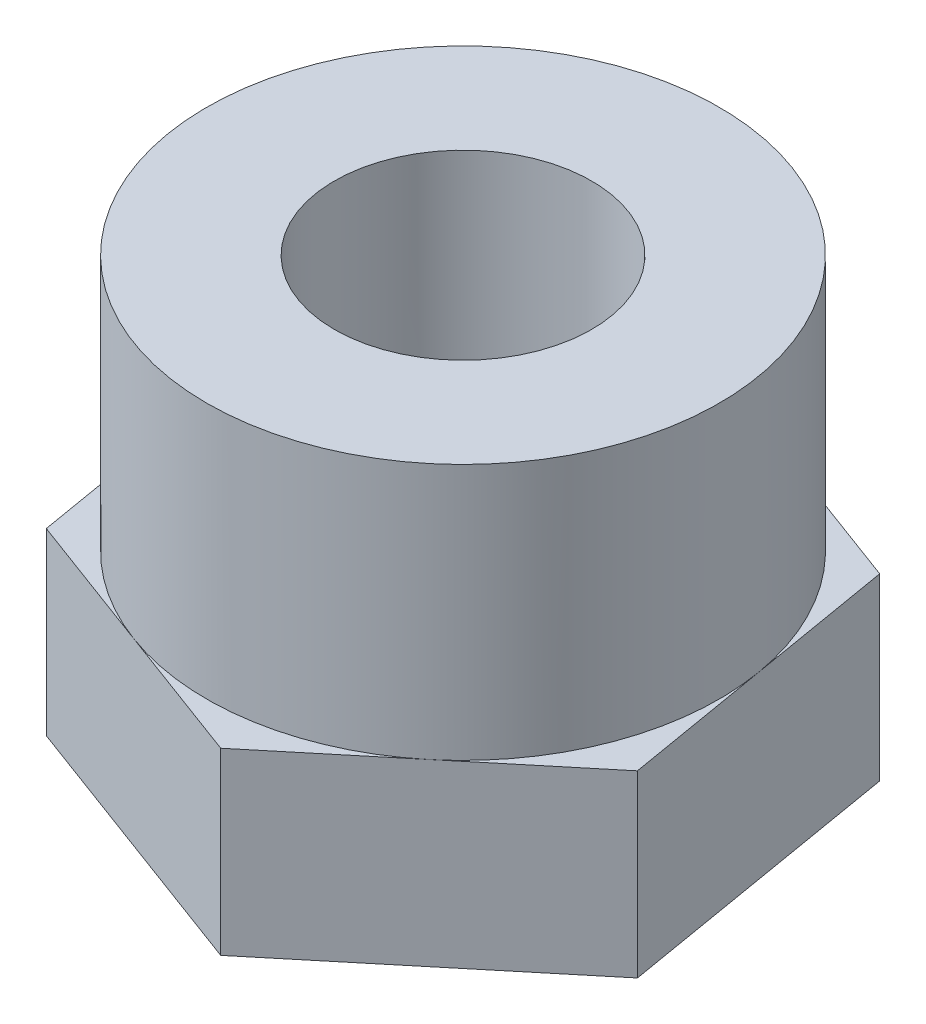
ISO-10303-21;
HEADER;
FILE_DESCRIPTION(('STEP AP214'),'2;1');
FILE_NAME('part.step','',(''),(''),'','','');
FILE_SCHEMA(('AUTOMOTIVE_DESIGN { 1 0 10303 214 1 1 1 1 }'));
ENDSEC;
DATA;
#1=APPLICATION_CONTEXT('core data for automotive mechanical design processes');
#2=APPLICATION_PROTOCOL_DEFINITION('international standard','automotive_design',2000,#1);
#3=PRODUCT_CONTEXT('',#1,'mechanical');
#4=PRODUCT('Part','Part','',(#3));
#5=PRODUCT_RELATED_PRODUCT_CATEGORY('part','',(#4));
#6=PRODUCT_DEFINITION_FORMATION('','',#4);
#7=PRODUCT_DEFINITION_CONTEXT('part definition',#1,'design');
#8=PRODUCT_DEFINITION('design','',#6,#7);
#9=PRODUCT_DEFINITION_SHAPE('','',#8);
#10=(LENGTH_UNIT() NAMED_UNIT(*) SI_UNIT(.MILLI.,.METRE.));
#11=(NAMED_UNIT(*) PLANE_ANGLE_UNIT() SI_UNIT($,.RADIAN.));
#12=(NAMED_UNIT(*) SI_UNIT($,.STERADIAN.) SOLID_ANGLE_UNIT());
#13=UNCERTAINTY_MEASURE_WITH_UNIT(LENGTH_MEASURE(1.E-05),#10,'distance_accuracy_value','');
#14=(GEOMETRIC_REPRESENTATION_CONTEXT(3) GLOBAL_UNCERTAINTY_ASSIGNED_CONTEXT((#13)) GLOBAL_UNIT_ASSIGNED_CONTEXT((#10,
#11,#12)) REPRESENTATION_CONTEXT('',''));
#15=CARTESIAN_POINT('',(0.,0.,0.));
#16=DIRECTION('',(0.,0.,1.));
#17=DIRECTION('',(1.,0.,0.));
#18=AXIS2_PLACEMENT_3D('',#15,#16,#17);
#19=CARTESIAN_POINT('',(0.,12.701,0.));
#20=DIRECTION('',(0.,-1.,0.));
#21=DIRECTION('',(0.,0.,-1.));
#22=AXIS2_PLACEMENT_3D('',#19,#20,#21);
#23=CYLINDRICAL_SURFACE('',#22,0.6);
#24=CARTESIAN_POINT('',(0.,-15.6449981495185,0.));
#25=DIRECTION('',(0.,-1.,0.));
#26=DIRECTION('',(0.,0.,-1.));
#27=AXIS2_PLACEMENT_3D('',#24,#25,#26);
#28=CIRCLE('',#27,0.6);
#29=CARTESIAN_POINT('',(0.,-15.6449981495185,-0.6));
#30=VERTEX_POINT('',#29);
#31=EDGE_CURVE('E143',#30,#30,#28,.T.);
#32=ORIENTED_EDGE('',*,*,#31,.T.);
#33=EDGE_LOOP('',(#32));
#34=FACE_BOUND('',#33,.T.);
#35=CARTESIAN_POINT('',(0.,-14.9991010883185,0.));
#36=DIRECTION('',(0.,1.,0.));
#37=DIRECTION('',(-1.,0.,0.));
#38=AXIS2_PLACEMENT_3D('',#35,#36,#37);
#39=CIRCLE('',#38,0.6);
#40=CARTESIAN_POINT('',(-0.599999999999998,-14.9991010883185,0.));
#41=VERTEX_POINT('',#40);
#42=EDGE_CURVE('E484',#41,#41,#39,.F.);
#43=ORIENTED_EDGE('',*,*,#42,.F.);
#44=EDGE_LOOP('',(#43));
#45=FACE_BOUND('',#44,.T.);
#46=ADVANCED_FACE('F39',(#34,#45),#23,.F.);
#47=CARTESIAN_POINT('',(0.,-8.89,0.));
#48=DIRECTION('',(0.,-1.,0.));
#49=DIRECTION('',(0.,0.,-1.));
#50=AXIS2_PLACEMENT_3D('',#47,#48,#49);
#51=PLANE('',#50);
#52=DIRECTION('',(-0.167247888684279,0.,-0.985914876513511));
#53=VECTOR('',#52,1.);
#54=CARTESIAN_POINT('',(-11.2947991395951,-8.89,9.35311957207513));
#55=LINE('',#54,#53);
#56=CARTESIAN_POINT('',(-11.2947991395951,-8.89,9.35311957207513));
#57=VERTEX_POINT('',#56);
#58=CARTESIAN_POINT('',(-12.5211189317216,-8.89,2.12404818629034));
#59=VERTEX_POINT('',#58);
#60=EDGE_CURVE('E141',#57,#59,#55,.T.);
#61=ORIENTED_EDGE('',*,*,#60,.T.);
#62=CARTESIAN_POINT('',(0.,-8.89,0.));
#63=DIRECTION('',(0.,1.,0.));
#64=DIRECTION('',(-1.,0.,0.));
#65=AXIS2_PLACEMENT_3D('',#62,#63,#64);
#66=CIRCLE('',#65,12.7);
#67=CARTESIAN_POINT('',(-4.42107977767109,-8.89,11.9056311718223));
#68=VERTEX_POINT('',#67);
#69=EDGE_CURVE('E50',#59,#68,#66,.T.);
#70=ORIENTED_EDGE('',*,*,#69,.T.);
#71=DIRECTION('',(-0.937451273371838,0.,-0.348116517926857));
#72=VECTOR('',#71,1.);
#73=CARTESIAN_POINT('',(2.45263958425293,-8.89,14.4581427715696));
#74=LINE('',#73,#72);
#75=EDGE_CURVE('E138',#68,#57,#74,.T.);
#76=ORIENTED_EDGE('',*,*,#75,.T.);
#77=EDGE_LOOP('',(#61,#70,#76));
#78=FACE_BOUND('',#77,.T.);
#79=ADVANCED_FACE('F137',(#78),#51,.T.);
#80=CARTESIAN_POINT('',(2.45263958425293,-8.89,14.4581427715696));
#81=VERTEX_POINT('',#80);
#82=EDGE_CURVE('E150',#81,#68,#74,.T.);
#83=ORIENTED_EDGE('',*,*,#82,.T.);
#84=CARTESIAN_POINT('',(8.10003915405049,-8.89,9.78158298553199));
#85=VERTEX_POINT('',#84);
#86=EDGE_CURVE('E11',#68,#85,#66,.T.);
#87=ORIENTED_EDGE('',*,*,#86,.T.);
#88=DIRECTION('',(-0.770203384687559,0.,0.637798358586653));
#89=VECTOR('',#88,1.);
#90=CARTESIAN_POINT('',(13.747438723848,-8.89,5.10502319949443));
#91=LINE('',#90,#89);
#92=EDGE_CURVE('E156',#85,#81,#91,.T.);
#93=ORIENTED_EDGE('',*,*,#92,.T.);
#94=EDGE_LOOP('',(#83,#87,#93));
#95=FACE_BOUND('',#94,.T.);
#96=ADVANCED_FACE('F155',(#95),#51,.T.);
#97=CARTESIAN_POINT('',(13.747438723848,-8.89,5.10502319949443));
#98=VERTEX_POINT('',#97);
#99=EDGE_CURVE('E153',#98,#85,#91,.T.);
#100=ORIENTED_EDGE('',*,*,#99,.T.);
#101=CARTESIAN_POINT('',(12.5211189317216,-8.89,-2.12404818629034));
#102=VERTEX_POINT('',#101);
#103=EDGE_CURVE('E48',#85,#102,#66,.T.);
#104=ORIENTED_EDGE('',*,*,#103,.T.);
#105=DIRECTION('',(0.167247888684279,0.,0.985914876513511));
#106=VECTOR('',#105,1.);
#107=CARTESIAN_POINT('',(11.2947991395951,-8.89,-9.35311957207513));
#108=LINE('',#107,#106);
#109=EDGE_CURVE('E270',#102,#98,#108,.T.);
#110=ORIENTED_EDGE('',*,*,#109,.T.);
#111=EDGE_LOOP('',(#100,#104,#110));
#112=FACE_BOUND('',#111,.T.);
#113=ADVANCED_FACE('F275',(#112),#51,.T.);
#114=CARTESIAN_POINT('',(11.2947991395951,-8.89,-9.35311957207513));
#115=VERTEX_POINT('',#114);
#116=EDGE_CURVE('E263',#115,#102,#108,.T.);
#117=ORIENTED_EDGE('',*,*,#116,.T.);
#118=CARTESIAN_POINT('',(4.42107977767109,-8.89,-11.9056311718223));
#119=VERTEX_POINT('',#118);
#120=EDGE_CURVE('E500',#102,#119,#66,.T.);
#121=ORIENTED_EDGE('',*,*,#120,.T.);
#122=DIRECTION('',(0.937451273371838,0.,0.348116517926857));
#123=VECTOR('',#122,1.);
#124=CARTESIAN_POINT('',(-2.45263958425294,-8.89,-14.4581427715696));
#125=LINE('',#124,#123);
#126=EDGE_CURVE('E189',#119,#115,#125,.T.);
#127=ORIENTED_EDGE('',*,*,#126,.T.);
#128=EDGE_LOOP('',(#117,#121,#127));
#129=FACE_BOUND('',#128,.T.);
#130=ADVANCED_FACE('F382',(#129),#51,.T.);
#131=CARTESIAN_POINT('',(-2.45263958425294,-8.89,-14.4581427715696));
#132=VERTEX_POINT('',#131);
#133=EDGE_CURVE('E236',#132,#119,#125,.T.);
#134=ORIENTED_EDGE('',*,*,#133,.T.);
#135=CARTESIAN_POINT('',(-8.1000391540505,-8.89,-9.78158298553199));
#136=VERTEX_POINT('',#135);
#137=EDGE_CURVE('E207',#119,#136,#66,.T.);
#138=ORIENTED_EDGE('',*,*,#137,.T.);
#139=DIRECTION('',(0.770203384687558,0.,-0.637798358586653));
#140=VECTOR('',#139,1.);
#141=CARTESIAN_POINT('',(-13.7474387238481,-8.89,-5.10502319949443));
#142=LINE('',#141,#140);
#143=EDGE_CURVE('E163',#136,#132,#142,.T.);
#144=ORIENTED_EDGE('',*,*,#143,.T.);
#145=EDGE_LOOP('',(#134,#138,#144));
#146=FACE_BOUND('',#145,.T.);
#147=ADVANCED_FACE('F269',(#146),#51,.T.);
#148=CARTESIAN_POINT('',(0.,12.7,0.));
#149=DIRECTION('',(0.,-1.,0.));
#150=DIRECTION('',(0.,0.,-1.));
#151=AXIS2_PLACEMENT_3D('',#148,#149,#150);
#152=CYLINDRICAL_SURFACE('',#151,12.7);
#153=CARTESIAN_POINT('',(0.,12.7,0.));
#154=DIRECTION('',(0.,1.,0.));
#155=DIRECTION('',(0.,0.,1.));
#156=AXIS2_PLACEMENT_3D('',#153,#154,#155);
#157=CIRCLE('',#156,12.7);
#158=CARTESIAN_POINT('',(0.,12.7,12.7));
#159=VERTEX_POINT('',#158);
#160=EDGE_CURVE('E203',#159,#159,#157,.T.);
#161=ORIENTED_EDGE('',*,*,#160,.F.);
#162=EDGE_LOOP('',(#161));
#163=FACE_BOUND('',#162,.T.);
#164=CARTESIAN_POINT('',(0.,0.,0.));
#165=DIRECTION('',(0.,1.,0.));
#166=DIRECTION('',(0.,0.,1.));
#167=AXIS2_PLACEMENT_3D('',#164,#165,#166);
#168=CIRCLE('',#167,12.7);
#169=CARTESIAN_POINT('',(8.10003915405049,0.,9.78158298553199));
#170=VERTEX_POINT('',#169);
#171=CARTESIAN_POINT('',(12.5211189317216,0.,-2.12404818629034));
#172=VERTEX_POINT('',#171);
#173=EDGE_CURVE('E43',#170,#172,#168,.T.);
#174=ORIENTED_EDGE('',*,*,#173,.T.);
#175=CARTESIAN_POINT('',(4.42107977767109,0.,-11.9056311718223));
#176=VERTEX_POINT('',#175);
#177=EDGE_CURVE('E209',#172,#176,#168,.T.);
#178=ORIENTED_EDGE('',*,*,#177,.T.);
#179=CARTESIAN_POINT('',(-8.1000391540505,0.,-9.781582985532));
#180=VERTEX_POINT('',#179);
#181=EDGE_CURVE('E214',#176,#180,#168,.T.);
#182=ORIENTED_EDGE('',*,*,#181,.T.);
#183=CARTESIAN_POINT('',(-12.5211189317216,0.,2.12404818629034));
#184=VERTEX_POINT('',#183);
#185=EDGE_CURVE('E217',#180,#184,#168,.T.);
#186=ORIENTED_EDGE('',*,*,#185,.T.);
#187=CARTESIAN_POINT('',(-4.42107977767109,0.,11.9056311718223));
#188=VERTEX_POINT('',#187);
#189=EDGE_CURVE('E215',#184,#188,#168,.T.);
#190=ORIENTED_EDGE('',*,*,#189,.T.);
#191=EDGE_CURVE('E202',#188,#170,#168,.T.);
#192=ORIENTED_EDGE('',*,*,#191,.T.);
#193=EDGE_LOOP('',(#174,#178,#182,#186,#190,#192));
#194=FACE_BOUND('',#193,.T.);
#195=ADVANCED_FACE('F41',(#163,#194),#152,.T.);
#196=CARTESIAN_POINT('',(0.,12.7,0.));
#197=DIRECTION('',(0.,1.,0.));
#198=DIRECTION('',(0.,0.,1.));
#199=AXIS2_PLACEMENT_3D('',#196,#197,#198);
#200=PLANE('',#199);
#201=CARTESIAN_POINT('',(0.,12.7,0.));
#202=DIRECTION('',(0.,1.,0.));
#203=DIRECTION('',(0.,0.,1.));
#204=AXIS2_PLACEMENT_3D('',#201,#202,#203);
#205=CIRCLE('',#204,6.3754);
#206=CARTESIAN_POINT('',(0.,12.7,6.3754));
#207=VERTEX_POINT('',#206);
#208=EDGE_CURVE('E482',#207,#207,#205,.T.);
#209=ORIENTED_EDGE('',*,*,#208,.F.);
#210=EDGE_LOOP('',(#209));
#211=FACE_BOUND('',#210,.T.);
#212=ORIENTED_EDGE('',*,*,#160,.T.);
#213=EDGE_LOOP('',(#212));
#214=FACE_BOUND('',#213,.T.);
#215=ADVANCED_FACE('F452',(#211,#214),#200,.T.);
#216=CARTESIAN_POINT('',(0.,0.,0.));
#217=DIRECTION('',(0.,-1.,0.));
#218=DIRECTION('',(0.,0.,-1.));
#219=AXIS2_PLACEMENT_3D('',#216,#217,#218);
#220=PLANE('',#219);
#221=ORIENTED_EDGE('',*,*,#173,.F.);
#222=DIRECTION('',(-0.770203384687559,0.,0.637798358586653));
#223=VECTOR('',#222,1.);
#224=CARTESIAN_POINT('',(13.747438723848,0.,5.10502319949443));
#225=LINE('',#224,#223);
#226=CARTESIAN_POINT('',(13.747438723848,0.,5.10502319949443));
#227=VERTEX_POINT('',#226);
#228=EDGE_CURVE('E64',#227,#170,#225,.T.);
#229=ORIENTED_EDGE('',*,*,#228,.F.);
#230=DIRECTION('',(0.167247888684279,0.,0.985914876513511));
#231=VECTOR('',#230,1.);
#232=CARTESIAN_POINT('',(11.2947991395951,0.,-9.35311957207513));
#233=LINE('',#232,#231);
#234=EDGE_CURVE('E171',#172,#227,#233,.T.);
#235=ORIENTED_EDGE('',*,*,#234,.F.);
#236=EDGE_LOOP('',(#221,#229,#235));
#237=FACE_BOUND('',#236,.T.);
#238=ADVANCED_FACE('F256',(#237),#220,.F.);
#239=ORIENTED_EDGE('',*,*,#177,.F.);
#240=CARTESIAN_POINT('',(11.2947991395951,0.,-9.35311957207513));
#241=VERTEX_POINT('',#240);
#242=EDGE_CURVE('E173',#241,#172,#233,.T.);
#243=ORIENTED_EDGE('',*,*,#242,.F.);
#244=DIRECTION('',(0.937451273371838,0.,0.348116517926857));
#245=VECTOR('',#244,1.);
#246=CARTESIAN_POINT('',(-2.45263958425294,0.,-14.4581427715696));
#247=LINE('',#246,#245);
#248=EDGE_CURVE('E172',#176,#241,#247,.T.);
#249=ORIENTED_EDGE('',*,*,#248,.F.);
#250=EDGE_LOOP('',(#239,#243,#249));
#251=FACE_BOUND('',#250,.T.);
#252=ADVANCED_FACE('F227',(#251),#220,.F.);
#253=ORIENTED_EDGE('',*,*,#181,.F.);
#254=CARTESIAN_POINT('',(-2.45263958425294,0.,-14.4581427715696));
#255=VERTEX_POINT('',#254);
#256=EDGE_CURVE('E168',#255,#176,#247,.T.);
#257=ORIENTED_EDGE('',*,*,#256,.F.);
#258=DIRECTION('',(0.770203384687558,0.,-0.637798358586653));
#259=VECTOR('',#258,1.);
#260=CARTESIAN_POINT('',(-13.7474387238481,0.,-5.10502319949443));
#261=LINE('',#260,#259);
#262=EDGE_CURVE('E185',#180,#255,#261,.T.);
#263=ORIENTED_EDGE('',*,*,#262,.F.);
#264=EDGE_LOOP('',(#253,#257,#263));
#265=FACE_BOUND('',#264,.T.);
#266=ADVANCED_FACE('F224',(#265),#220,.F.);
#267=ORIENTED_EDGE('',*,*,#185,.F.);
#268=CARTESIAN_POINT('',(-13.7474387238481,0.,-5.10502319949443));
#269=VERTEX_POINT('',#268);
#270=EDGE_CURVE('E186',#269,#180,#261,.T.);
#271=ORIENTED_EDGE('',*,*,#270,.F.);
#272=DIRECTION('',(-0.167247888684279,0.,-0.985914876513511));
#273=VECTOR('',#272,1.);
#274=CARTESIAN_POINT('',(-11.2947991395951,0.,9.35311957207513));
#275=LINE('',#274,#273);
#276=EDGE_CURVE('E181',#184,#269,#275,.T.);
#277=ORIENTED_EDGE('',*,*,#276,.F.);
#278=EDGE_LOOP('',(#267,#271,#277));
#279=FACE_BOUND('',#278,.T.);
#280=ADVANCED_FACE('F245',(#279),#220,.F.);
#281=ORIENTED_EDGE('',*,*,#189,.F.);
#282=CARTESIAN_POINT('',(-11.2947991395951,0.,9.35311957207513));
#283=VERTEX_POINT('',#282);
#284=EDGE_CURVE('E182',#283,#184,#275,.T.);
#285=ORIENTED_EDGE('',*,*,#284,.F.);
#286=DIRECTION('',(-0.937451273371838,0.,-0.348116517926857));
#287=VECTOR('',#286,1.);
#288=CARTESIAN_POINT('',(2.45263958425293,0.,14.4581427715696));
#289=LINE('',#288,#287);
#290=EDGE_CURVE('E178',#188,#283,#289,.T.);
#291=ORIENTED_EDGE('',*,*,#290,.F.);
#292=EDGE_LOOP('',(#281,#285,#291));
#293=FACE_BOUND('',#292,.T.);
#294=ADVANCED_FACE('F251',(#293),#220,.F.);
#295=CARTESIAN_POINT('',(-2.45263958425294,-8.89,-14.4581427715696));
#296=DIRECTION('',(-0.348116517926857,0.,0.937451273371838));
#297=DIRECTION('',(0.937451273371838,0.,0.348116517926857));
#298=AXIS2_PLACEMENT_3D('',#295,#296,#297);
#299=PLANE('',#298);
#300=ORIENTED_EDGE('',*,*,#256,.T.);
#301=ORIENTED_EDGE('',*,*,#248,.T.);
#302=DIRECTION('',(0.,1.,0.));
#303=VECTOR('',#302,1.);
#304=CARTESIAN_POINT('',(11.2947991395951,-8.89,-9.35311957207513));
#305=LINE('',#304,#303);
#306=EDGE_CURVE('E200',#115,#241,#305,.T.);
#307=ORIENTED_EDGE('',*,*,#306,.F.);
#308=ORIENTED_EDGE('',*,*,#126,.F.);
#309=ORIENTED_EDGE('',*,*,#133,.F.);
#310=DIRECTION('',(0.,1.,0.));
#311=VECTOR('',#310,1.);
#312=CARTESIAN_POINT('',(-2.45263958425294,-8.89,-14.4581427715696));
#313=LINE('',#312,#311);
#314=EDGE_CURVE('E167',#132,#255,#313,.T.);
#315=ORIENTED_EDGE('',*,*,#314,.T.);
#316=EDGE_LOOP('',(#300,#301,#307,#308,#309,#315));
#317=FACE_BOUND('',#316,.T.);
#318=ADVANCED_FACE('F231',(#317),#299,.F.);
#319=CARTESIAN_POINT('',(11.2947991395951,-8.89,-9.35311957207513));
#320=DIRECTION('',(-0.985914876513511,0.,0.167247888684279));
#321=DIRECTION('',(0.167247888684279,0.,0.985914876513511));
#322=AXIS2_PLACEMENT_3D('',#319,#320,#321);
#323=PLANE('',#322);
#324=ORIENTED_EDGE('',*,*,#242,.T.);
#325=ORIENTED_EDGE('',*,*,#234,.T.);
#326=DIRECTION('',(0.,1.,0.));
#327=VECTOR('',#326,1.);
#328=CARTESIAN_POINT('',(13.747438723848,-8.89,5.10502319949443));
#329=LINE('',#328,#327);
#330=EDGE_CURVE('E198',#98,#227,#329,.T.);
#331=ORIENTED_EDGE('',*,*,#330,.F.);
#332=ORIENTED_EDGE('',*,*,#109,.F.);
#333=ORIENTED_EDGE('',*,*,#116,.F.);
#334=ORIENTED_EDGE('',*,*,#306,.T.);
#335=EDGE_LOOP('',(#324,#325,#331,#332,#333,#334));
#336=FACE_BOUND('',#335,.T.);
#337=ADVANCED_FACE('F259',(#336),#323,.F.);
#338=CARTESIAN_POINT('',(13.747438723848,-8.89,5.10502319949443));
#339=DIRECTION('',(-0.637798358586653,0.,-0.770203384687558));
#340=DIRECTION('',(-0.770203384687559,0.,0.637798358586653));
#341=AXIS2_PLACEMENT_3D('',#338,#339,#340);
#342=PLANE('',#341);
#343=ORIENTED_EDGE('',*,*,#228,.T.);
#344=CARTESIAN_POINT('',(2.45263958425293,0.,14.4581427715696));
#345=VERTEX_POINT('',#344);
#346=EDGE_CURVE('E176',#170,#345,#225,.T.);
#347=ORIENTED_EDGE('',*,*,#346,.T.);
#348=DIRECTION('',(0.,1.,0.));
#349=VECTOR('',#348,1.);
#350=CARTESIAN_POINT('',(2.45263958425293,-8.89,14.4581427715696));
#351=LINE('',#350,#349);
#352=EDGE_CURVE('E196',#81,#345,#351,.T.);
#353=ORIENTED_EDGE('',*,*,#352,.F.);
#354=ORIENTED_EDGE('',*,*,#92,.F.);
#355=ORIENTED_EDGE('',*,*,#99,.F.);
#356=ORIENTED_EDGE('',*,*,#330,.T.);
#357=EDGE_LOOP('',(#343,#347,#353,#354,#355,#356));
#358=FACE_BOUND('',#357,.T.);
#359=ADVANCED_FACE('F276',(#358),#342,.F.);
#360=CARTESIAN_POINT('',(2.45263958425293,-8.89,14.4581427715696));
#361=DIRECTION('',(0.348116517926857,0.,-0.937451273371838));
#362=DIRECTION('',(-0.937451273371838,0.,-0.348116517926857));
#363=AXIS2_PLACEMENT_3D('',#360,#361,#362);
#364=PLANE('',#363);
#365=EDGE_CURVE('E179',#345,#188,#289,.T.);
#366=ORIENTED_EDGE('',*,*,#365,.T.);
#367=ORIENTED_EDGE('',*,*,#290,.T.);
#368=DIRECTION('',(0.,1.,0.));
#369=VECTOR('',#368,1.);
#370=CARTESIAN_POINT('',(-11.2947991395951,-8.89,9.35311957207513));
#371=LINE('',#370,#369);
#372=EDGE_CURVE('E152',#57,#283,#371,.T.);
#373=ORIENTED_EDGE('',*,*,#372,.F.);
#374=ORIENTED_EDGE('',*,*,#75,.F.);
#375=ORIENTED_EDGE('',*,*,#82,.F.);
#376=ORIENTED_EDGE('',*,*,#352,.T.);
#377=EDGE_LOOP('',(#366,#367,#373,#374,#375,#376));
#378=FACE_BOUND('',#377,.T.);
#379=ADVANCED_FACE('F148',(#378),#364,.F.);
#380=CARTESIAN_POINT('',(-11.2947991395951,-8.89,9.35311957207513));
#381=DIRECTION('',(0.985914876513511,0.,-0.167247888684279));
#382=DIRECTION('',(-0.167247888684279,0.,-0.985914876513511));
#383=AXIS2_PLACEMENT_3D('',#380,#381,#382);
#384=PLANE('',#383);
#385=ORIENTED_EDGE('',*,*,#284,.T.);
#386=ORIENTED_EDGE('',*,*,#276,.T.);
#387=DIRECTION('',(0.,1.,0.));
#388=VECTOR('',#387,1.);
#389=CARTESIAN_POINT('',(-13.7474387238481,-8.89,-5.10502319949443));
#390=LINE('',#389,#388);
#391=CARTESIAN_POINT('',(-13.7474387238481,-8.89,-5.10502319949443));
#392=VERTEX_POINT('',#391);
#393=EDGE_CURVE('E192',#392,#269,#390,.T.);
#394=ORIENTED_EDGE('',*,*,#393,.F.);
#395=EDGE_CURVE('E158',#59,#392,#55,.T.);
#396=ORIENTED_EDGE('',*,*,#395,.F.);
#397=ORIENTED_EDGE('',*,*,#60,.F.);
#398=ORIENTED_EDGE('',*,*,#372,.T.);
#399=EDGE_LOOP('',(#385,#386,#394,#396,#397,#398));
#400=FACE_BOUND('',#399,.T.);
#401=ADVANCED_FACE('F248',(#400),#384,.F.);
#402=CARTESIAN_POINT('',(-13.7474387238481,-8.89,-5.10502319949443));
#403=DIRECTION('',(0.637798358586653,0.,0.770203384687558));
#404=DIRECTION('',(0.770203384687558,0.,-0.637798358586653));
#405=AXIS2_PLACEMENT_3D('',#402,#403,#404);
#406=PLANE('',#405);
#407=ORIENTED_EDGE('',*,*,#270,.T.);
#408=ORIENTED_EDGE('',*,*,#262,.T.);
#409=ORIENTED_EDGE('',*,*,#314,.F.);
#410=ORIENTED_EDGE('',*,*,#143,.F.);
#411=EDGE_CURVE('E164',#392,#136,#142,.T.);
#412=ORIENTED_EDGE('',*,*,#411,.F.);
#413=ORIENTED_EDGE('',*,*,#393,.T.);
#414=EDGE_LOOP('',(#407,#408,#409,#410,#412,#413));
#415=FACE_BOUND('',#414,.T.);
#416=ADVANCED_FACE('F239',(#415),#406,.F.);
#417=ORIENTED_EDGE('',*,*,#411,.T.);
#418=EDGE_CURVE('E144',#136,#59,#66,.T.);
#419=ORIENTED_EDGE('',*,*,#418,.T.);
#420=ORIENTED_EDGE('',*,*,#395,.T.);
#421=EDGE_LOOP('',(#417,#419,#420));
#422=FACE_BOUND('',#421,.T.);
#423=ADVANCED_FACE('F292',(#422),#51,.T.);
#424=ORIENTED_EDGE('',*,*,#191,.F.);
#425=ORIENTED_EDGE('',*,*,#365,.F.);
#426=ORIENTED_EDGE('',*,*,#346,.F.);
#427=EDGE_LOOP('',(#424,#425,#426));
#428=FACE_BOUND('',#427,.T.);
#429=ADVANCED_FACE('F254',(#428),#220,.F.);
#430=CARTESIAN_POINT('',(0.,-15.6449981495185,0.));
#431=DIRECTION('',(0.,1.,0.));
#432=DIRECTION('',(-1.,0.,0.));
#433=AXIS2_PLACEMENT_3D('',#430,#431,#432);
#434=CONICAL_SURFACE('',#433,1.,1.0471975511966);
#435=ORIENTED_EDGE('',*,*,#69,.F.);
#436=ORIENTED_EDGE('',*,*,#418,.F.);
#437=ORIENTED_EDGE('',*,*,#137,.F.);
#438=ORIENTED_EDGE('',*,*,#120,.F.);
#439=ORIENTED_EDGE('',*,*,#103,.F.);
#440=ORIENTED_EDGE('',*,*,#86,.F.);
#441=EDGE_LOOP('',(#435,#436,#437,#438,#439,#440));
#442=FACE_BOUND('',#441,.T.);
#443=CARTESIAN_POINT('',(0.,-15.6449981495185,0.));
#444=DIRECTION('',(0.,1.,0.));
#445=DIRECTION('',(-1.,0.,0.));
#446=AXIS2_PLACEMENT_3D('',#443,#444,#445);
#447=CIRCLE('',#446,1.);
#448=CARTESIAN_POINT('',(-0.999999999999999,-15.6449981495185,0.));
#449=VERTEX_POINT('',#448);
#450=EDGE_CURVE('E142',#449,#449,#447,.T.);
#451=ORIENTED_EDGE('',*,*,#450,.T.);
#452=EDGE_LOOP('',(#451));
#453=FACE_BOUND('',#452,.T.);
#454=ADVANCED_FACE('F128',(#442,#453),#434,.T.);
#455=CARTESIAN_POINT('',(0.,-15.6449981495185,0.));
#456=DIRECTION('',(0.,1.,0.));
#457=DIRECTION('',(-1.,0.,0.));
#458=AXIS2_PLACEMENT_3D('',#455,#456,#457);
#459=PLANE('',#458);
#460=ORIENTED_EDGE('',*,*,#31,.F.);
#461=EDGE_LOOP('',(#460));
#462=FACE_BOUND('',#461,.T.);
#463=ORIENTED_EDGE('',*,*,#450,.F.);
#464=EDGE_LOOP('',(#463));
#465=FACE_BOUND('',#464,.T.);
#466=ADVANCED_FACE('F299',(#462,#465),#459,.F.);
#467=CARTESIAN_POINT('',(0.,0.868680000000002,0.));
#468=DIRECTION('',(0.,1.,0.));
#469=DIRECTION('',(0.,0.,1.));
#470=AXIS2_PLACEMENT_3D('',#467,#468,#469);
#471=CYLINDRICAL_SURFACE('',#470,6.3754);
#472=CARTESIAN_POINT('',(0.,0.868680000000001,0.));
#473=DIRECTION('',(0.,1.,0.));
#474=DIRECTION('',(-1.,0.,0.));
#475=AXIS2_PLACEMENT_3D('',#472,#473,#474);
#476=CIRCLE('',#475,6.3754);
#477=CARTESIAN_POINT('',(-6.3754,0.868680000000004,0.));
#478=VERTEX_POINT('',#477);
#479=EDGE_CURVE('E488',#478,#478,#476,.T.);
#480=ORIENTED_EDGE('',*,*,#479,.F.);
#481=EDGE_LOOP('',(#480));
#482=FACE_BOUND('',#481,.T.);
#483=ORIENTED_EDGE('',*,*,#208,.T.);
#484=EDGE_LOOP('',(#483));
#485=FACE_BOUND('',#484,.T.);
#486=ADVANCED_FACE('F297',(#482,#485),#471,.F.);
#487=CARTESIAN_POINT('',(0.,-16.6475875399913,0.));
#488=DIRECTION('',(0.,1.,0.));
#489=DIRECTION('',(-1.,0.,0.));
#490=AXIS2_PLACEMENT_3D('',#487,#488,#489);
#491=CONICAL_SURFACE('',#490,0.,0.349065850398859);
#492=CARTESIAN_POINT('',(-6.3754,0.868680000000004,0.));
#493=CARTESIAN_POINT('',(-6.31523958333333,0.703390613663352,0.));
#494=CARTESIAN_POINT('',(-6.25507916666667,0.538101227326701,0.));
#495=CARTESIAN_POINT('',(-6.13475833333333,0.207522454653398,0.));
#496=CARTESIAN_POINT('',(-6.07459791666667,0.0422330683167462,0.));
#497=CARTESIAN_POINT('',(-5.95427708333333,-0.288345704356557,0.));
#498=CARTESIAN_POINT('',(-5.89411666666667,-0.453635090693209,0.));
#499=CARTESIAN_POINT('',(-5.77379583333333,-0.784213863366511,0.));
#500=CARTESIAN_POINT('',(-5.71363541666667,-0.949503249703163,0.));
#501=CARTESIAN_POINT('',(-5.59331458333333,-1.28008202237647,0.));
#502=CARTESIAN_POINT('',(-5.53315416666667,-1.44537140871312,0.));
#503=CARTESIAN_POINT('',(-5.41283333333333,-1.77595018138642,0.));
#504=CARTESIAN_POINT('',(-5.35267291666667,-1.94123956772307,0.));
#505=CARTESIAN_POINT('',(-5.23235208333333,-2.27181834039637,0.));
#506=CARTESIAN_POINT('',(-5.17219166666667,-2.43710772673303,0.));
#507=CARTESIAN_POINT('',(-5.05187083333333,-2.76768649940633,0.));
#508=CARTESIAN_POINT('',(-4.99171041666667,-2.93297588574298,0.));
#509=CARTESIAN_POINT('',(-4.87138958333333,-3.26355465841628,0.));
#510=CARTESIAN_POINT('',(-4.81122916666667,-3.42884404475294,0.));
#511=CARTESIAN_POINT('',(-4.69090833333333,-3.75942281742624,0.));
#512=CARTESIAN_POINT('',(-4.63074791666667,-3.92471220376289,0.));
#513=CARTESIAN_POINT('',(-4.51042708333333,-4.25529097643619,0.));
#514=CARTESIAN_POINT('',(-4.45026666666667,-4.42058036277284,0.));
#515=CARTESIAN_POINT('',(-4.32994583333333,-4.75115913544615,0.));
#516=CARTESIAN_POINT('',(-4.26978541666667,-4.9164485217828,0.));
#517=CARTESIAN_POINT('',(-4.14946458333333,-5.2470272944561,0.));
#518=CARTESIAN_POINT('',(-4.08930416666667,-5.41231668079276,0.));
#519=CARTESIAN_POINT('',(-3.96898333333333,-5.74289545346606,0.));
#520=CARTESIAN_POINT('',(-3.90882291666667,-5.90818483980271,0.));
#521=CARTESIAN_POINT('',(-3.78850208333333,-6.23876361247601,0.));
#522=CARTESIAN_POINT('',(-3.72834166666667,-6.40405299881266,0.));
#523=CARTESIAN_POINT('',(-3.60802083333333,-6.73463177148597,0.));
#524=CARTESIAN_POINT('',(-3.54786041666667,-6.89992115782262,0.));
#525=CARTESIAN_POINT('',(-3.42753958333333,-7.23049993049592,0.));
#526=CARTESIAN_POINT('',(-3.36737916666667,-7.39578931683257,0.));
#527=CARTESIAN_POINT('',(-3.24705833333333,-7.72636808950588,0.));
#528=CARTESIAN_POINT('',(-3.18689791666667,-7.89165747584253,0.));
#529=CARTESIAN_POINT('',(-3.06657708333333,-8.22223624851583,0.));
#530=CARTESIAN_POINT('',(-3.00641666666667,-8.38752563485248,0.));
#531=CARTESIAN_POINT('',(-2.88609583333333,-8.71810440752578,0.));
#532=CARTESIAN_POINT('',(-2.82593541666667,-8.88339379386244,0.));
#533=CARTESIAN_POINT('',(-2.70561458333333,-9.21397256653574,0.));
#534=CARTESIAN_POINT('',(-2.64545416666667,-9.37926195287239,0.));
#535=CARTESIAN_POINT('',(-2.52513333333333,-9.70984072554569,0.));
#536=CARTESIAN_POINT('',(-2.46497291666667,-9.87513011188235,0.));
#537=CARTESIAN_POINT('',(-2.34465208333333,-10.2057088845556,0.));
#538=CARTESIAN_POINT('',(-2.28449166666667,-10.3709982708923,0.));
#539=CARTESIAN_POINT('',(-2.16417083333333,-10.7015770435656,0.));
#540=CARTESIAN_POINT('',(-2.10401041666667,-10.8668664299023,0.));
#541=CARTESIAN_POINT('',(-1.98368958333333,-11.1974452025756,0.));
#542=CARTESIAN_POINT('',(-1.92352916666667,-11.3627345889122,0.));
#543=CARTESIAN_POINT('',(-1.80320833333333,-11.6933133615855,0.));
#544=CARTESIAN_POINT('',(-1.74304791666667,-11.8586027479222,0.));
#545=CARTESIAN_POINT('',(-1.62272708333333,-12.1891815205955,0.));
#546=CARTESIAN_POINT('',(-1.56256666666667,-12.3544709069321,0.));
#547=CARTESIAN_POINT('',(-1.44224583333333,-12.6850496796054,0.));
#548=CARTESIAN_POINT('',(-1.38208541666667,-12.8503390659421,0.));
#549=CARTESIAN_POINT('',(-1.26176458333333,-13.1809178386154,0.));
#550=CARTESIAN_POINT('',(-1.20160416666667,-13.346207224952,0.));
#551=CARTESIAN_POINT('',(-1.08128333333333,-13.6767859976253,0.));
#552=CARTESIAN_POINT('',(-1.02112291666667,-13.842075383962,0.));
#553=CARTESIAN_POINT('',(-0.900802083333332,-14.1726541566353,0.));
#554=CARTESIAN_POINT('',(-0.840641666666665,-14.3379435429719,0.));
#555=CARTESIAN_POINT('',(-0.720320833333332,-14.6685223156452,0.));
#556=CARTESIAN_POINT('',(-0.660160416666665,-14.8338117019819,0.));
#557=CARTESIAN_POINT('',(-0.599999999999999,-14.9991010883185,0.));
#558=B_SPLINE_CURVE_WITH_KNOTS('',3,(#492,#493,#494,#495,#496,#497,#498,#499,#500,#501,#502,
#503,#504,#505,#506,#507,#508,#509,#510,#511,#512,#513,#514,#515,#516,#517,#518,#519,#520,#521,
#522,#523,#524,#525,#526,#527,#528,#529,#530,#531,#532,#533,#534,#535,#536,#537,#538,#539,#540,
#541,#542,#543,#544,#545,#546,#547,#548,#549,#550,#551,#552,#553,#554,#555,#556,#557),
.UNSPECIFIED.,.F.,.F.,(4,2,2,2,2,2,2,2,2,2,2,2,2,2,2,2,2,2,2,2,2,2,2,2,2,2,2,2,2,2,2,2,4),(0.,
0.527691872896943,1.05538374579389,1.58307561869083,2.11076749158777,2.63845936448472,
3.16615123738166,3.6938431102786,4.22153498317555,4.74922685607249,5.27691872896944,
5.80461060186638,6.33230247476332,6.85999434766027,7.38768622055721,7.91537809345416,
8.4430699663511,8.97076183924804,9.49845371214499,10.0261455850419,10.5538374579389,
11.0815293308358,11.6092212037328,12.1369130766297,12.6646049495267,13.1922968224236,
13.7199886953205,14.2476805682175,14.7753724411144,15.3030643140114,15.8307561869083,
16.3584480598053,16.8861399327022),.UNSPECIFIED.);
#559=EDGE_CURVE('BSEAM345',#478,#41,#558,.T.);
#560=ORIENTED_EDGE('',*,*,#479,.T.);
#561=ORIENTED_EDGE('',*,*,#42,.T.);
#562=ORIENTED_EDGE('',*,*,#559,.T.);
#563=ORIENTED_EDGE('',*,*,#559,.F.);
#564=EDGE_LOOP('',(#560,#562,#561,#563));
#565=FACE_BOUND('',#564,.T.);
#566=ADVANCED_FACE('F345',(#565),#491,.F.);
#567=CLOSED_SHELL('',(#46,#79,#96,#113,#130,#147,#195,#215,#238,#252,#266,#280,#294,#318,#337,
#359,#379,#401,#416,#423,#429,#454,#466,#486,#566));
#568=MANIFOLD_SOLID_BREP('B2',#567);
#569=ADVANCED_BREP_SHAPE_REPRESENTATION('',(#18,#568),#14);
#570=SHAPE_DEFINITION_REPRESENTATION(#9,#569);
ENDSEC;
END-ISO-10303-21;
